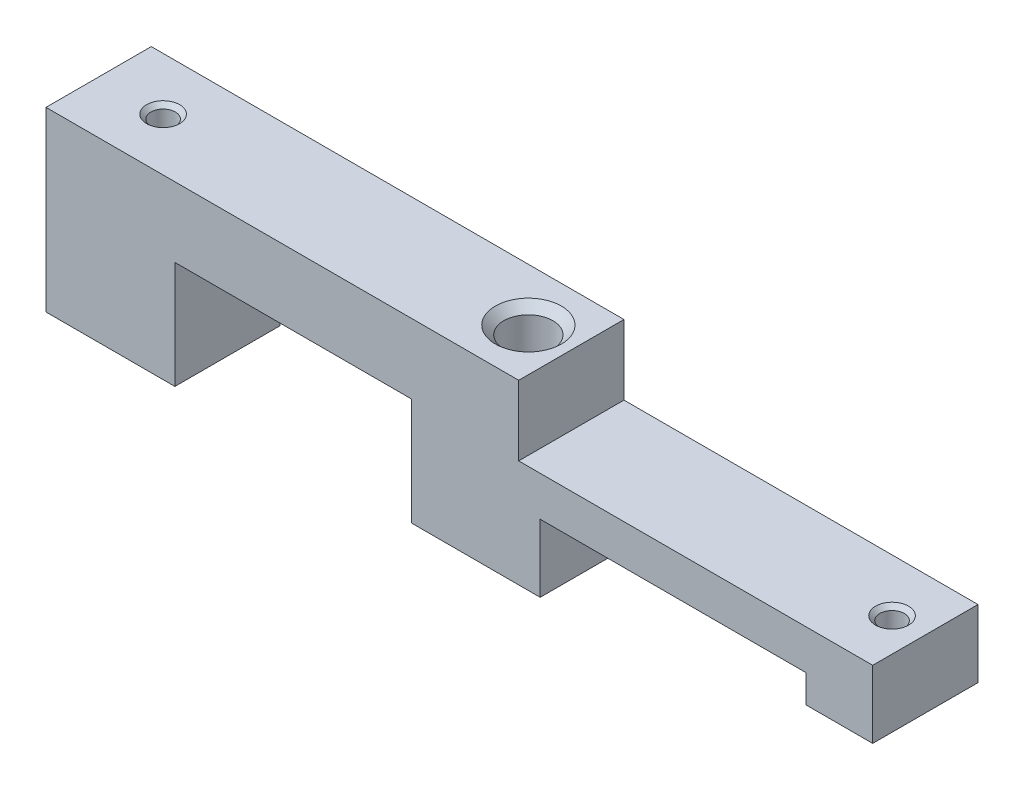
ISO-10303-21;
HEADER;
FILE_DESCRIPTION(('STEP AP214'),'2;1');
FILE_NAME('part.step','',(''),(''),'','','');
FILE_SCHEMA(('AUTOMOTIVE_DESIGN { 1 0 10303 214 1 1 1 1 }'));
ENDSEC;
DATA;
#1=APPLICATION_CONTEXT('core data for automotive mechanical design processes');
#2=APPLICATION_PROTOCOL_DEFINITION('international standard','automotive_design',2000,#1);
#3=PRODUCT_CONTEXT('',#1,'mechanical');
#4=PRODUCT('Part','Part','',(#3));
#5=PRODUCT_RELATED_PRODUCT_CATEGORY('part','',(#4));
#6=PRODUCT_DEFINITION_FORMATION('','',#4);
#7=PRODUCT_DEFINITION_CONTEXT('part definition',#1,'design');
#8=PRODUCT_DEFINITION('design','',#6,#7);
#9=PRODUCT_DEFINITION_SHAPE('','',#8);
#10=(LENGTH_UNIT() NAMED_UNIT(*) SI_UNIT(.MILLI.,.METRE.));
#11=(NAMED_UNIT(*) PLANE_ANGLE_UNIT() SI_UNIT($,.RADIAN.));
#12=(NAMED_UNIT(*) SI_UNIT($,.STERADIAN.) SOLID_ANGLE_UNIT());
#13=UNCERTAINTY_MEASURE_WITH_UNIT(LENGTH_MEASURE(1.E-05),#10,'distance_accuracy_value','');
#14=(GEOMETRIC_REPRESENTATION_CONTEXT(3) GLOBAL_UNCERTAINTY_ASSIGNED_CONTEXT((#13)) GLOBAL_UNIT_ASSIGNED_CONTEXT((#10,
#11,#12)) REPRESENTATION_CONTEXT('',''));
#15=CARTESIAN_POINT('',(0.,0.,0.));
#16=DIRECTION('',(0.,0.,1.));
#17=DIRECTION('',(1.,0.,0.));
#18=AXIS2_PLACEMENT_3D('',#15,#16,#17);
#19=CARTESIAN_POINT('',(-7.874,3.302,12.446));
#20=DIRECTION('',(1.,0.,0.));
#21=DIRECTION('',(0.,0.,-1.));
#22=AXIS2_PLACEMENT_3D('',#19,#20,#21);
#23=PLANE('',#22);
#24=DIRECTION('',(0.,-1.,0.));
#25=VECTOR('',#24,1.);
#26=CARTESIAN_POINT('',(-7.874,3.302,0.));
#27=LINE('',#26,#25);
#28=CARTESIAN_POINT('',(-7.874,3.302,0.));
#29=VERTEX_POINT('',#28);
#30=CARTESIAN_POINT('',(-7.874,0.,0.));
#31=VERTEX_POINT('',#30);
#32=EDGE_CURVE('E185',#29,#31,#27,.T.);
#33=ORIENTED_EDGE('',*,*,#32,.T.);
#34=DIRECTION('',(0.,0.,-1.));
#35=VECTOR('',#34,1.);
#36=CARTESIAN_POINT('',(-7.874,0.,12.446));
#37=LINE('',#36,#35);
#38=CARTESIAN_POINT('',(-7.874,0.,12.446));
#39=VERTEX_POINT('',#38);
#40=EDGE_CURVE('E271',#39,#31,#37,.T.);
#41=ORIENTED_EDGE('',*,*,#40,.F.);
#42=DIRECTION('',(0.,-1.,0.));
#43=VECTOR('',#42,1.);
#44=CARTESIAN_POINT('',(-7.874,3.302,12.446));
#45=LINE('',#44,#43);
#46=CARTESIAN_POINT('',(-7.874,3.302,12.446));
#47=VERTEX_POINT('',#46);
#48=EDGE_CURVE('E228',#47,#39,#45,.T.);
#49=ORIENTED_EDGE('',*,*,#48,.F.);
#50=DIRECTION('',(0.,0.,-1.));
#51=VECTOR('',#50,1.);
#52=CARTESIAN_POINT('',(-7.874,3.302,12.446));
#53=LINE('',#52,#51);
#54=EDGE_CURVE('E181',#47,#29,#53,.T.);
#55=ORIENTED_EDGE('',*,*,#54,.T.);
#56=EDGE_LOOP('',(#33,#41,#49,#55));
#57=FACE_BOUND('',#56,.T.);
#58=ADVANCED_FACE('F45',(#57),#23,.F.);
#59=CARTESIAN_POINT('',(-7.874,0.,12.446));
#60=DIRECTION('',(0.,1.,0.));
#61=DIRECTION('',(0.,0.,1.));
#62=AXIS2_PLACEMENT_3D('',#59,#60,#61);
#63=PLANE('',#62);
#64=CARTESIAN_POINT('',(-3.937,0.,6.223));
#65=DIRECTION('',(0.,-1.,0.));
#66=DIRECTION('',(0.,0.,-1.));
#67=AXIS2_PLACEMENT_3D('',#64,#65,#66);
#68=CIRCLE('',#67,1.450000021);
#69=CARTESIAN_POINT('',(-3.937,0.,4.772999979));
#70=VERTEX_POINT('',#69);
#71=EDGE_CURVE('E440',#70,#70,#68,.T.);
#72=ORIENTED_EDGE('',*,*,#71,.F.);
#73=EDGE_LOOP('',(#72));
#74=FACE_BOUND('',#73,.T.);
#75=DIRECTION('',(1.,0.,0.));
#76=VECTOR('',#75,1.);
#77=CARTESIAN_POINT('',(-7.874,0.,0.));
#78=LINE('',#77,#76);
#79=CARTESIAN_POINT('',(0.,0.,0.));
#80=VERTEX_POINT('',#79);
#81=EDGE_CURVE('E189',#31,#80,#78,.T.);
#82=ORIENTED_EDGE('',*,*,#81,.T.);
#83=DIRECTION('',(0.,0.,-1.));
#84=VECTOR('',#83,1.);
#85=CARTESIAN_POINT('',(0.,0.,12.446));
#86=LINE('',#85,#84);
#87=CARTESIAN_POINT('',(0.,0.,12.446));
#88=VERTEX_POINT('',#87);
#89=EDGE_CURVE('E267',#88,#80,#86,.T.);
#90=ORIENTED_EDGE('',*,*,#89,.F.);
#91=DIRECTION('',(1.,0.,0.));
#92=VECTOR('',#91,1.);
#93=CARTESIAN_POINT('',(-7.874,0.,12.446));
#94=LINE('',#93,#92);
#95=EDGE_CURVE('E126',#39,#88,#94,.T.);
#96=ORIENTED_EDGE('',*,*,#95,.F.);
#97=ORIENTED_EDGE('',*,*,#40,.T.);
#98=EDGE_LOOP('',(#82,#90,#96,#97));
#99=FACE_BOUND('',#98,.T.);
#100=ADVANCED_FACE('F306',(#74,#99),#63,.F.);
#101=CARTESIAN_POINT('',(0.,0.,12.446));
#102=DIRECTION('',(-1.,0.,0.));
#103=DIRECTION('',(0.,0.,1.));
#104=AXIS2_PLACEMENT_3D('',#101,#102,#103);
#105=PLANE('',#104);
#106=DIRECTION('',(0.,1.,0.));
#107=VECTOR('',#106,1.);
#108=CARTESIAN_POINT('',(0.,0.,0.));
#109=LINE('',#108,#107);
#110=CARTESIAN_POINT('',(0.,8.00100000000001,0.));
#111=VERTEX_POINT('',#110);
#112=EDGE_CURVE('E193',#80,#111,#109,.T.);
#113=ORIENTED_EDGE('',*,*,#112,.T.);
#114=DIRECTION('',(0.,0.,-1.));
#115=VECTOR('',#114,1.);
#116=CARTESIAN_POINT('',(0.,8.00100000000001,12.446));
#117=LINE('',#116,#115);
#118=CARTESIAN_POINT('',(0.,8.00100000000001,12.446));
#119=VERTEX_POINT('',#118);
#120=EDGE_CURVE('E263',#119,#111,#117,.T.);
#121=ORIENTED_EDGE('',*,*,#120,.F.);
#122=DIRECTION('',(0.,1.,0.));
#123=VECTOR('',#122,1.);
#124=CARTESIAN_POINT('',(0.,0.,12.446));
#125=LINE('',#124,#123);
#126=EDGE_CURVE('E431',#88,#119,#125,.T.);
#127=ORIENTED_EDGE('',*,*,#126,.F.);
#128=ORIENTED_EDGE('',*,*,#89,.T.);
#129=EDGE_LOOP('',(#113,#121,#127,#128));
#130=FACE_BOUND('',#129,.T.);
#131=ADVANCED_FACE('F312',(#130),#105,.F.);
#132=CARTESIAN_POINT('',(0.,8.00100000000001,12.446));
#133=DIRECTION('',(0.,-1.,0.));
#134=DIRECTION('',(1.,0.,0.));
#135=AXIS2_PLACEMENT_3D('',#132,#133,#134);
#136=PLANE('',#135);
#137=CARTESIAN_POINT('',(-3.937,8.00100000000001,6.223));
#138=DIRECTION('',(0.,-1.,0.));
#139=DIRECTION('',(1.,0.,0.));
#140=AXIS2_PLACEMENT_3D('',#137,#138,#139);
#141=CIRCLE('',#140,1.95000002099999);
#142=CARTESIAN_POINT('',(-1.98699997900001,8.00100000000001,6.223));
#143=VERTEX_POINT('',#142);
#144=EDGE_CURVE('E282',#143,#143,#141,.T.);
#145=ORIENTED_EDGE('',*,*,#144,.T.);
#146=EDGE_LOOP('',(#145));
#147=FACE_BOUND('',#146,.T.);
#148=DIRECTION('',(-1.,0.,0.));
#149=VECTOR('',#148,1.);
#150=CARTESIAN_POINT('',(0.,8.00100000000001,0.));
#151=LINE('',#150,#149);
#152=CARTESIAN_POINT('',(-41.850200018,8.001,0.));
#153=VERTEX_POINT('',#152);
#154=EDGE_CURVE('E196',#111,#153,#151,.T.);
#155=ORIENTED_EDGE('',*,*,#154,.T.);
#156=DIRECTION('',(0.,0.,-1.));
#157=VECTOR('',#156,1.);
#158=CARTESIAN_POINT('',(-41.850200018,8.001,12.446));
#159=LINE('',#158,#157);
#160=CARTESIAN_POINT('',(-41.850200018,8.001,12.446));
#161=VERTEX_POINT('',#160);
#162=EDGE_CURVE('E259',#161,#153,#159,.T.);
#163=ORIENTED_EDGE('',*,*,#162,.F.);
#164=DIRECTION('',(-1.,0.,0.));
#165=VECTOR('',#164,1.);
#166=CARTESIAN_POINT('',(0.,8.00100000000001,12.446));
#167=LINE('',#166,#165);
#168=EDGE_CURVE('E427',#119,#161,#167,.T.);
#169=ORIENTED_EDGE('',*,*,#168,.F.);
#170=ORIENTED_EDGE('',*,*,#120,.T.);
#171=EDGE_LOOP('',(#155,#163,#169,#170));
#172=FACE_BOUND('',#171,.T.);
#173=ADVANCED_FACE('F413',(#147,#172),#136,.F.);
#174=CARTESIAN_POINT('',(-41.850200018,8.001,12.446));
#175=DIRECTION('',(-1.,0.,0.));
#176=DIRECTION('',(0.,-1.,0.));
#177=AXIS2_PLACEMENT_3D('',#174,#175,#176);
#178=PLANE('',#177);
#179=DIRECTION('',(0.,1.,0.));
#180=VECTOR('',#179,1.);
#181=CARTESIAN_POINT('',(-41.850200018,8.001,0.));
#182=LINE('',#181,#180);
#183=CARTESIAN_POINT('',(-41.850200018,16.256,0.));
#184=VERTEX_POINT('',#183);
#185=EDGE_CURVE('E199',#153,#184,#182,.T.);
#186=ORIENTED_EDGE('',*,*,#185,.T.);
#187=DIRECTION('',(0.,0.,-1.));
#188=VECTOR('',#187,1.);
#189=CARTESIAN_POINT('',(-41.850200018,16.256,12.446));
#190=LINE('',#189,#188);
#191=CARTESIAN_POINT('',(-41.850200018,16.256,12.446));
#192=VERTEX_POINT('',#191);
#193=EDGE_CURVE('E255',#192,#184,#190,.T.);
#194=ORIENTED_EDGE('',*,*,#193,.F.);
#195=DIRECTION('',(0.,1.,0.));
#196=VECTOR('',#195,1.);
#197=CARTESIAN_POINT('',(-41.850200018,8.001,12.446));
#198=LINE('',#197,#196);
#199=EDGE_CURVE('E360',#161,#192,#198,.T.);
#200=ORIENTED_EDGE('',*,*,#199,.F.);
#201=ORIENTED_EDGE('',*,*,#162,.T.);
#202=EDGE_LOOP('',(#186,#194,#200,#201));
#203=FACE_BOUND('',#202,.T.);
#204=ADVANCED_FACE('F340',(#203),#178,.F.);
#205=CARTESIAN_POINT('',(-97.730200018,16.256,12.446));
#206=DIRECTION('',(0.,-1.,0.));
#207=DIRECTION('',(0.,0.,-1.));
#208=AXIS2_PLACEMENT_3D('',#205,#206,#207);
#209=PLANE('',#208);
#210=CARTESIAN_POINT('',(-46.930200018,16.256,6.223));
#211=DIRECTION('',(0.,-1.,0.));
#212=DIRECTION('',(0.,0.,-1.));
#213=AXIS2_PLACEMENT_3D('',#210,#211,#212);
#214=CIRCLE('',#213,3.90000004199997);
#215=CARTESIAN_POINT('',(-46.930200018,16.256,2.32299995800003));
#216=VERTEX_POINT('',#215);
#217=EDGE_CURVE('E56',#216,#216,#214,.T.);
#218=ORIENTED_EDGE('',*,*,#217,.T.);
#219=EDGE_LOOP('',(#218));
#220=FACE_BOUND('',#219,.T.);
#221=CARTESIAN_POINT('',(-90.110200018,16.256,6.223));
#222=DIRECTION('',(0.,-1.,0.));
#223=DIRECTION('',(0.,0.,-1.));
#224=AXIS2_PLACEMENT_3D('',#221,#222,#223);
#225=CIRCLE('',#224,1.95000002099995);
#226=CARTESIAN_POINT('',(-90.110200018,16.256,4.27299997900006));
#227=VERTEX_POINT('',#226);
#228=EDGE_CURVE('E274',#227,#227,#225,.T.);
#229=ORIENTED_EDGE('',*,*,#228,.T.);
#230=EDGE_LOOP('',(#229));
#231=FACE_BOUND('',#230,.T.);
#232=DIRECTION('',(-1.,0.,0.));
#233=VECTOR('',#232,1.);
#234=CARTESIAN_POINT('',(-97.730200018,16.256,0.));
#235=LINE('',#234,#233);
#236=CARTESIAN_POINT('',(-97.730200018,16.256,0.));
#237=VERTEX_POINT('',#236);
#238=EDGE_CURVE('E203',#184,#237,#235,.T.);
#239=ORIENTED_EDGE('',*,*,#238,.T.);
#240=DIRECTION('',(0.,0.,-1.));
#241=VECTOR('',#240,1.);
#242=CARTESIAN_POINT('',(-97.730200018,16.256,12.446));
#243=LINE('',#242,#241);
#244=CARTESIAN_POINT('',(-97.730200018,16.256,12.446));
#245=VERTEX_POINT('',#244);
#246=EDGE_CURVE('E251',#245,#237,#243,.T.);
#247=ORIENTED_EDGE('',*,*,#246,.F.);
#248=DIRECTION('',(-1.,0.,0.));
#249=VECTOR('',#248,1.);
#250=CARTESIAN_POINT('',(-41.850200018,16.256,12.446));
#251=LINE('',#250,#249);
#252=EDGE_CURVE('E354',#192,#245,#251,.T.);
#253=ORIENTED_EDGE('',*,*,#252,.F.);
#254=ORIENTED_EDGE('',*,*,#193,.T.);
#255=EDGE_LOOP('',(#239,#247,#253,#254));
#256=FACE_BOUND('',#255,.T.);
#257=ADVANCED_FACE('F293',(#220,#231,#256),#209,.F.);
#258=CARTESIAN_POINT('',(-97.730200018,8.001,12.446));
#259=DIRECTION('',(1.,0.,0.));
#260=DIRECTION('',(0.,0.,-1.));
#261=AXIS2_PLACEMENT_3D('',#258,#259,#260);
#262=PLANE('',#261);
#263=DIRECTION('',(0.,-1.,0.));
#264=VECTOR('',#263,1.);
#265=CARTESIAN_POINT('',(-97.730200018,8.001,0.));
#266=LINE('',#265,#264);
#267=CARTESIAN_POINT('',(-97.730200018,-4.699,0.));
#268=VERTEX_POINT('',#267);
#269=EDGE_CURVE('E207',#237,#268,#266,.T.);
#270=ORIENTED_EDGE('',*,*,#269,.T.);
#271=DIRECTION('',(0.,0.,-1.));
#272=VECTOR('',#271,1.);
#273=CARTESIAN_POINT('',(-97.730200018,-4.699,12.446));
#274=LINE('',#273,#272);
#275=CARTESIAN_POINT('',(-97.730200018,-4.699,12.446));
#276=VERTEX_POINT('',#275);
#277=EDGE_CURVE('E247',#276,#268,#274,.T.);
#278=ORIENTED_EDGE('',*,*,#277,.F.);
#279=DIRECTION('',(0.,-1.,0.));
#280=VECTOR('',#279,1.);
#281=CARTESIAN_POINT('',(-97.730200018,8.001,12.446));
#282=LINE('',#281,#280);
#283=EDGE_CURVE('E350',#245,#276,#282,.T.);
#284=ORIENTED_EDGE('',*,*,#283,.F.);
#285=ORIENTED_EDGE('',*,*,#246,.T.);
#286=EDGE_LOOP('',(#270,#278,#284,#285));
#287=FACE_BOUND('',#286,.T.);
#288=ADVANCED_FACE('F339',(#287),#262,.F.);
#289=CARTESIAN_POINT('',(-97.730200018,-4.699,12.446));
#290=DIRECTION('',(0.,1.,0.));
#291=DIRECTION('',(0.,0.,1.));
#292=AXIS2_PLACEMENT_3D('',#289,#290,#291);
#293=PLANE('',#292);
#294=DIRECTION('',(1.,0.,0.));
#295=VECTOR('',#294,1.);
#296=CARTESIAN_POINT('',(-97.730200018,-4.699,0.));
#297=LINE('',#296,#295);
#298=CARTESIAN_POINT('',(-82.490200018,-4.699,0.));
#299=VERTEX_POINT('',#298);
#300=EDGE_CURVE('E210',#268,#299,#297,.T.);
#301=ORIENTED_EDGE('',*,*,#300,.T.);
#302=DIRECTION('',(0.,0.,-1.));
#303=VECTOR('',#302,1.);
#304=CARTESIAN_POINT('',(-82.490200018,-4.699,12.446));
#305=LINE('',#304,#303);
#306=CARTESIAN_POINT('',(-82.490200018,-4.699,12.446));
#307=VERTEX_POINT('',#306);
#308=EDGE_CURVE('E243',#307,#299,#305,.T.);
#309=ORIENTED_EDGE('',*,*,#308,.F.);
#310=DIRECTION('',(1.,0.,0.));
#311=VECTOR('',#310,1.);
#312=CARTESIAN_POINT('',(-97.730200018,-4.699,12.446));
#313=LINE('',#312,#311);
#314=EDGE_CURVE('E353',#276,#307,#313,.T.);
#315=ORIENTED_EDGE('',*,*,#314,.F.);
#316=ORIENTED_EDGE('',*,*,#277,.T.);
#317=EDGE_LOOP('',(#301,#309,#315,#316));
#318=FACE_BOUND('',#317,.T.);
#319=ADVANCED_FACE('F404',(#318),#293,.F.);
#320=CARTESIAN_POINT('',(-82.490200018,-4.699,12.446));
#321=DIRECTION('',(-1.,0.,0.));
#322=DIRECTION('',(0.,0.,1.));
#323=AXIS2_PLACEMENT_3D('',#320,#321,#322);
#324=PLANE('',#323);
#325=DIRECTION('',(0.,1.,0.));
#326=VECTOR('',#325,1.);
#327=CARTESIAN_POINT('',(-82.490200018,-4.699,0.));
#328=LINE('',#327,#326);
#329=CARTESIAN_POINT('',(-82.490200018,8.001,0.));
#330=VERTEX_POINT('',#329);
#331=EDGE_CURVE('E213',#299,#330,#328,.T.);
#332=ORIENTED_EDGE('',*,*,#331,.T.);
#333=DIRECTION('',(0.,0.,-1.));
#334=VECTOR('',#333,1.);
#335=CARTESIAN_POINT('',(-82.490200018,8.001,12.446));
#336=LINE('',#335,#334);
#337=CARTESIAN_POINT('',(-82.490200018,8.001,12.446));
#338=VERTEX_POINT('',#337);
#339=EDGE_CURVE('E239',#338,#330,#336,.T.);
#340=ORIENTED_EDGE('',*,*,#339,.F.);
#341=DIRECTION('',(0.,1.,0.));
#342=VECTOR('',#341,1.);
#343=CARTESIAN_POINT('',(-82.490200018,-4.699,12.446));
#344=LINE('',#343,#342);
#345=EDGE_CURVE('E358',#307,#338,#344,.T.);
#346=ORIENTED_EDGE('',*,*,#345,.F.);
#347=ORIENTED_EDGE('',*,*,#308,.T.);
#348=EDGE_LOOP('',(#332,#340,#346,#347));
#349=FACE_BOUND('',#348,.T.);
#350=ADVANCED_FACE('F401',(#349),#324,.F.);
#351=CARTESIAN_POINT('',(-82.490200018,8.001,12.446));
#352=DIRECTION('',(0.,1.,0.));
#353=DIRECTION('',(0.,0.,1.));
#354=AXIS2_PLACEMENT_3D('',#351,#352,#353);
#355=PLANE('',#354);
#356=DIRECTION('',(1.,0.,0.));
#357=VECTOR('',#356,1.);
#358=CARTESIAN_POINT('',(-82.490200018,8.001,0.));
#359=LINE('',#358,#357);
#360=CARTESIAN_POINT('',(-54.550200018,8.001,0.));
#361=VERTEX_POINT('',#360);
#362=EDGE_CURVE('E216',#330,#361,#359,.T.);
#363=ORIENTED_EDGE('',*,*,#362,.T.);
#364=DIRECTION('',(0.,0.,-1.));
#365=VECTOR('',#364,1.);
#366=CARTESIAN_POINT('',(-54.550200018,8.001,12.446));
#367=LINE('',#366,#365);
#368=CARTESIAN_POINT('',(-54.550200018,8.001,12.446));
#369=VERTEX_POINT('',#368);
#370=EDGE_CURVE('E235',#369,#361,#367,.T.);
#371=ORIENTED_EDGE('',*,*,#370,.F.);
#372=DIRECTION('',(1.,0.,0.));
#373=VECTOR('',#372,1.);
#374=CARTESIAN_POINT('',(-82.490200018,8.001,12.446));
#375=LINE('',#374,#373);
#376=EDGE_CURVE('E366',#338,#369,#375,.T.);
#377=ORIENTED_EDGE('',*,*,#376,.F.);
#378=ORIENTED_EDGE('',*,*,#339,.T.);
#379=EDGE_LOOP('',(#363,#371,#377,#378));
#380=FACE_BOUND('',#379,.T.);
#381=ADVANCED_FACE('F374',(#380),#355,.F.);
#382=CARTESIAN_POINT('',(-54.550200018,8.001,12.446));
#383=DIRECTION('',(1.,0.,0.));
#384=DIRECTION('',(0.,0.,-1.));
#385=AXIS2_PLACEMENT_3D('',#382,#383,#384);
#386=PLANE('',#385);
#387=DIRECTION('',(0.,-1.,0.));
#388=VECTOR('',#387,1.);
#389=CARTESIAN_POINT('',(-54.550200018,8.001,0.));
#390=LINE('',#389,#388);
#391=CARTESIAN_POINT('',(-54.550200018,-4.699,0.));
#392=VERTEX_POINT('',#391);
#393=EDGE_CURVE('E219',#361,#392,#390,.T.);
#394=ORIENTED_EDGE('',*,*,#393,.T.);
#395=DIRECTION('',(0.,0.,-1.));
#396=VECTOR('',#395,1.);
#397=CARTESIAN_POINT('',(-54.550200018,-4.699,12.446));
#398=LINE('',#397,#396);
#399=CARTESIAN_POINT('',(-54.550200018,-4.699,12.446));
#400=VERTEX_POINT('',#399);
#401=EDGE_CURVE('E174',#400,#392,#398,.T.);
#402=ORIENTED_EDGE('',*,*,#401,.F.);
#403=DIRECTION('',(0.,-1.,0.));
#404=VECTOR('',#403,1.);
#405=CARTESIAN_POINT('',(-54.550200018,8.001,12.446));
#406=LINE('',#405,#404);
#407=EDGE_CURVE('E163',#369,#400,#406,.T.);
#408=ORIENTED_EDGE('',*,*,#407,.F.);
#409=ORIENTED_EDGE('',*,*,#370,.T.);
#410=EDGE_LOOP('',(#394,#402,#408,#409));
#411=FACE_BOUND('',#410,.T.);
#412=ADVANCED_FACE('F378',(#411),#386,.F.);
#413=CARTESIAN_POINT('',(-54.550200018,-4.699,12.446));
#414=DIRECTION('',(0.,1.,0.));
#415=DIRECTION('',(0.,0.,1.));
#416=AXIS2_PLACEMENT_3D('',#413,#414,#415);
#417=PLANE('',#416);
#418=DIRECTION('',(1.,0.,0.));
#419=VECTOR('',#418,1.);
#420=CARTESIAN_POINT('',(-54.550200018,-4.699,0.));
#421=LINE('',#420,#419);
#422=CARTESIAN_POINT('',(-39.310200018,-4.699,0.));
#423=VERTEX_POINT('',#422);
#424=EDGE_CURVE('E172',#392,#423,#421,.T.);
#425=ORIENTED_EDGE('',*,*,#424,.T.);
#426=DIRECTION('',(0.,0.,-1.));
#427=VECTOR('',#426,1.);
#428=CARTESIAN_POINT('',(-39.310200018,-4.699,12.446));
#429=LINE('',#428,#427);
#430=CARTESIAN_POINT('',(-39.310200018,-4.699,12.446));
#431=VERTEX_POINT('',#430);
#432=EDGE_CURVE('E169',#431,#423,#429,.T.);
#433=ORIENTED_EDGE('',*,*,#432,.F.);
#434=DIRECTION('',(1.,0.,0.));
#435=VECTOR('',#434,1.);
#436=CARTESIAN_POINT('',(-54.550200018,-4.699,12.446));
#437=LINE('',#436,#435);
#438=EDGE_CURVE('E157',#400,#431,#437,.T.);
#439=ORIENTED_EDGE('',*,*,#438,.F.);
#440=ORIENTED_EDGE('',*,*,#401,.T.);
#441=EDGE_LOOP('',(#425,#433,#439,#440));
#442=FACE_BOUND('',#441,.T.);
#443=ADVANCED_FACE('F170',(#442),#417,.F.);
#444=CARTESIAN_POINT('',(-39.310200018,-4.699,12.446));
#445=DIRECTION('',(-1.,0.,0.));
#446=DIRECTION('',(0.,0.,1.));
#447=AXIS2_PLACEMENT_3D('',#444,#445,#446);
#448=PLANE('',#447);
#449=DIRECTION('',(0.,1.,0.));
#450=VECTOR('',#449,1.);
#451=CARTESIAN_POINT('',(-39.310200018,-4.699,0.));
#452=LINE('',#451,#450);
#453=CARTESIAN_POINT('',(-39.310200018,3.302,0.));
#454=VERTEX_POINT('',#453);
#455=EDGE_CURVE('E111',#423,#454,#452,.T.);
#456=ORIENTED_EDGE('',*,*,#455,.T.);
#457=DIRECTION('',(0.,0.,-1.));
#458=VECTOR('',#457,1.);
#459=CARTESIAN_POINT('',(-39.310200018,3.302,12.446));
#460=LINE('',#459,#458);
#461=CARTESIAN_POINT('',(-39.310200018,3.302,12.446));
#462=VERTEX_POINT('',#461);
#463=EDGE_CURVE('E175',#462,#454,#460,.T.);
#464=ORIENTED_EDGE('',*,*,#463,.F.);
#465=DIRECTION('',(0.,1.,0.));
#466=VECTOR('',#465,1.);
#467=CARTESIAN_POINT('',(-39.310200018,-4.699,12.446));
#468=LINE('',#467,#466);
#469=EDGE_CURVE('E161',#431,#462,#468,.T.);
#470=ORIENTED_EDGE('',*,*,#469,.F.);
#471=ORIENTED_EDGE('',*,*,#432,.T.);
#472=EDGE_LOOP('',(#456,#464,#470,#471));
#473=FACE_BOUND('',#472,.T.);
#474=ADVANCED_FACE('F177',(#473),#448,.F.);
#475=CARTESIAN_POINT('',(-39.310200018,3.302,12.446));
#476=DIRECTION('',(0.,1.,0.));
#477=DIRECTION('',(0.,0.,1.));
#478=AXIS2_PLACEMENT_3D('',#475,#476,#477);
#479=PLANE('',#478);
#480=DIRECTION('',(1.,0.,0.));
#481=VECTOR('',#480,1.);
#482=CARTESIAN_POINT('',(-39.310200018,3.302,0.));
#483=LINE('',#482,#481);
#484=EDGE_CURVE('E117',#454,#29,#483,.T.);
#485=ORIENTED_EDGE('',*,*,#484,.T.);
#486=ORIENTED_EDGE('',*,*,#54,.F.);
#487=DIRECTION('',(1.,0.,0.));
#488=VECTOR('',#487,1.);
#489=CARTESIAN_POINT('',(-39.310200018,3.302,12.446));
#490=LINE('',#489,#488);
#491=EDGE_CURVE('E64',#462,#47,#490,.T.);
#492=ORIENTED_EDGE('',*,*,#491,.F.);
#493=ORIENTED_EDGE('',*,*,#463,.T.);
#494=EDGE_LOOP('',(#485,#486,#492,#493));
#495=FACE_BOUND('',#494,.T.);
#496=ADVANCED_FACE('F384',(#495),#479,.F.);
#497=CARTESIAN_POINT('',(0.,0.,12.446));
#498=DIRECTION('',(0.,0.,1.));
#499=DIRECTION('',(1.,0.,0.));
#500=AXIS2_PLACEMENT_3D('',#497,#498,#499);
#501=PLANE('',#500);
#502=ORIENTED_EDGE('',*,*,#48,.T.);
#503=ORIENTED_EDGE('',*,*,#95,.T.);
#504=ORIENTED_EDGE('',*,*,#126,.T.);
#505=ORIENTED_EDGE('',*,*,#168,.T.);
#506=ORIENTED_EDGE('',*,*,#199,.T.);
#507=ORIENTED_EDGE('',*,*,#252,.T.);
#508=ORIENTED_EDGE('',*,*,#283,.T.);
#509=ORIENTED_EDGE('',*,*,#314,.T.);
#510=ORIENTED_EDGE('',*,*,#345,.T.);
#511=ORIENTED_EDGE('',*,*,#376,.T.);
#512=ORIENTED_EDGE('',*,*,#407,.T.);
#513=ORIENTED_EDGE('',*,*,#438,.T.);
#514=ORIENTED_EDGE('',*,*,#469,.T.);
#515=ORIENTED_EDGE('',*,*,#491,.T.);
#516=EDGE_LOOP('',(#502,#503,#504,#505,#506,#507,#508,#509,#510,#511,#512,#513,#514,#515));
#517=FACE_BOUND('',#516,.T.);
#518=ADVANCED_FACE('F159',(#517),#501,.T.);
#519=CARTESIAN_POINT('',(0.,0.,0.));
#520=DIRECTION('',(0.,0.,1.));
#521=DIRECTION('',(1.,0.,0.));
#522=AXIS2_PLACEMENT_3D('',#519,#520,#521);
#523=PLANE('',#522);
#524=ORIENTED_EDGE('',*,*,#32,.F.);
#525=ORIENTED_EDGE('',*,*,#484,.F.);
#526=ORIENTED_EDGE('',*,*,#455,.F.);
#527=ORIENTED_EDGE('',*,*,#424,.F.);
#528=ORIENTED_EDGE('',*,*,#393,.F.);
#529=ORIENTED_EDGE('',*,*,#362,.F.);
#530=ORIENTED_EDGE('',*,*,#331,.F.);
#531=ORIENTED_EDGE('',*,*,#300,.F.);
#532=ORIENTED_EDGE('',*,*,#269,.F.);
#533=ORIENTED_EDGE('',*,*,#238,.F.);
#534=ORIENTED_EDGE('',*,*,#185,.F.);
#535=ORIENTED_EDGE('',*,*,#154,.F.);
#536=ORIENTED_EDGE('',*,*,#112,.F.);
#537=ORIENTED_EDGE('',*,*,#81,.F.);
#538=EDGE_LOOP('',(#524,#525,#526,#527,#528,#529,#530,#531,#532,#533,#534,#535,#536,#537));
#539=FACE_BOUND('',#538,.T.);
#540=ADVANCED_FACE('F380',(#539),#523,.F.);
#541=CARTESIAN_POINT('',(-46.930200018,16.256,6.223));
#542=DIRECTION('',(0.,-1.,0.));
#543=DIRECTION('',(0.,0.,-1.));
#544=AXIS2_PLACEMENT_3D('',#541,#542,#543);
#545=CYLINDRICAL_SURFACE('',#544,2.900000042);
#546=CARTESIAN_POINT('',(-46.930200018,15.256,6.223));
#547=DIRECTION('',(0.,-1.,0.));
#548=DIRECTION('',(0.,0.,-1.));
#549=AXIS2_PLACEMENT_3D('',#546,#547,#548);
#550=CIRCLE('',#549,2.900000042);
#551=CARTESIAN_POINT('',(-46.930200018,15.256,3.322999958));
#552=VERTEX_POINT('',#551);
#553=EDGE_CURVE('E11',#552,#552,#550,.F.);
#554=ORIENTED_EDGE('',*,*,#553,.T.);
#555=EDGE_LOOP('',(#554));
#556=FACE_BOUND('',#555,.T.);
#557=CARTESIAN_POINT('',(-46.930200018,0.,6.223));
#558=DIRECTION('',(0.,-1.,0.));
#559=DIRECTION('',(0.,0.,-1.));
#560=AXIS2_PLACEMENT_3D('',#557,#558,#559);
#561=CIRCLE('',#560,2.900000042);
#562=CARTESIAN_POINT('',(-46.930200018,0.,3.322999958));
#563=VERTEX_POINT('',#562);
#564=EDGE_CURVE('E444',#563,#563,#561,.T.);
#565=ORIENTED_EDGE('',*,*,#564,.T.);
#566=EDGE_LOOP('',(#565));
#567=FACE_BOUND('',#566,.T.);
#568=ADVANCED_FACE('F463',(#556,#567),#545,.F.);
#569=CARTESIAN_POINT('',(-46.930200018,0.,6.223));
#570=DIRECTION('',(0.,-1.,0.));
#571=DIRECTION('',(0.,0.,-1.));
#572=AXIS2_PLACEMENT_3D('',#569,#570,#571);
#573=PLANE('',#572);
#574=ORIENTED_EDGE('',*,*,#564,.F.);
#575=EDGE_LOOP('',(#574));
#576=FACE_BOUND('',#575,.T.);
#577=ADVANCED_FACE('F459',(#576),#573,.F.);
#578=CARTESIAN_POINT('',(-90.110200018,16.256,6.223));
#579=DIRECTION('',(0.,-1.,0.));
#580=DIRECTION('',(0.,0.,-1.));
#581=AXIS2_PLACEMENT_3D('',#578,#579,#580);
#582=CYLINDRICAL_SURFACE('',#581,1.45000002099999);
#583=CARTESIAN_POINT('',(-90.110200018,15.756,6.223));
#584=DIRECTION('',(0.,-1.,0.));
#585=DIRECTION('',(0.,0.,-1.));
#586=AXIS2_PLACEMENT_3D('',#583,#584,#585);
#587=CIRCLE('',#586,1.45000002099999);
#588=CARTESIAN_POINT('',(-90.110200018,15.756,4.77299997900001));
#589=VERTEX_POINT('',#588);
#590=EDGE_CURVE('E278',#589,#589,#587,.F.);
#591=ORIENTED_EDGE('',*,*,#590,.T.);
#592=EDGE_LOOP('',(#591));
#593=FACE_BOUND('',#592,.T.);
#594=CARTESIAN_POINT('',(-90.110200018,0.,6.223));
#595=DIRECTION('',(0.,-1.,0.));
#596=DIRECTION('',(0.,0.,-1.));
#597=AXIS2_PLACEMENT_3D('',#594,#595,#596);
#598=CIRCLE('',#597,1.45000002099999);
#599=CARTESIAN_POINT('',(-90.110200018,0.,4.77299997900001));
#600=VERTEX_POINT('',#599);
#601=EDGE_CURVE('E190',#600,#600,#598,.T.);
#602=ORIENTED_EDGE('',*,*,#601,.T.);
#603=EDGE_LOOP('',(#602));
#604=FACE_BOUND('',#603,.T.);
#605=ADVANCED_FACE('F452',(#593,#604),#582,.F.);
#606=CARTESIAN_POINT('',(-90.110200018,0.,6.223));
#607=DIRECTION('',(0.,-1.,0.));
#608=DIRECTION('',(0.,0.,-1.));
#609=AXIS2_PLACEMENT_3D('',#606,#607,#608);
#610=PLANE('',#609);
#611=ORIENTED_EDGE('',*,*,#601,.F.);
#612=EDGE_LOOP('',(#611));
#613=FACE_BOUND('',#612,.T.);
#614=ADVANCED_FACE('F331',(#613),#610,.F.);
#615=CARTESIAN_POINT('',(-3.937,16.256,6.223));
#616=DIRECTION('',(0.,-1.,0.));
#617=DIRECTION('',(0.,0.,-1.));
#618=AXIS2_PLACEMENT_3D('',#615,#616,#617);
#619=CYLINDRICAL_SURFACE('',#618,1.450000021);
#620=CARTESIAN_POINT('',(-3.937,7.50100000000001,6.223));
#621=DIRECTION('',(0.,-1.,0.));
#622=DIRECTION('',(0.,0.,-1.));
#623=AXIS2_PLACEMENT_3D('',#620,#621,#622);
#624=CIRCLE('',#623,1.450000021);
#625=CARTESIAN_POINT('',(-3.937,7.50100000000001,4.772999979));
#626=VERTEX_POINT('',#625);
#627=EDGE_CURVE('E286',#626,#626,#624,.F.);
#628=ORIENTED_EDGE('',*,*,#627,.T.);
#629=EDGE_LOOP('',(#628));
#630=FACE_BOUND('',#629,.T.);
#631=ORIENTED_EDGE('',*,*,#71,.T.);
#632=EDGE_LOOP('',(#631));
#633=FACE_BOUND('',#632,.T.);
#634=ADVANCED_FACE('F322',(#630,#633),#619,.F.);
#635=CARTESIAN_POINT('',(-90.110200018,16.256,6.223));
#636=DIRECTION('',(0.,1.,0.));
#637=DIRECTION('',(0.,0.,1.));
#638=AXIS2_PLACEMENT_3D('',#635,#636,#637);
#639=CONICAL_SURFACE('',#638,1.95000002099995,0.785398163397441);
#640=ORIENTED_EDGE('',*,*,#590,.F.);
#641=EDGE_LOOP('',(#640));
#642=FACE_BOUND('',#641,.T.);
#643=ORIENTED_EDGE('',*,*,#228,.F.);
#644=EDGE_LOOP('',(#643));
#645=FACE_BOUND('',#644,.T.);
#646=ADVANCED_FACE('F302',(#642,#645),#639,.F.);
#647=CARTESIAN_POINT('',(-3.937,8.00100000000001,6.223));
#648=DIRECTION('',(0.,1.,0.));
#649=DIRECTION('',(0.,0.,1.));
#650=AXIS2_PLACEMENT_3D('',#647,#648,#649);
#651=CONICAL_SURFACE('',#650,1.95000002099999,0.78539816339744);
#652=ORIENTED_EDGE('',*,*,#627,.F.);
#653=EDGE_LOOP('',(#652));
#654=FACE_BOUND('',#653,.T.);
#655=ORIENTED_EDGE('',*,*,#144,.F.);
#656=EDGE_LOOP('',(#655));
#657=FACE_BOUND('',#656,.T.);
#658=ADVANCED_FACE('F297',(#654,#657),#651,.F.);
#659=CARTESIAN_POINT('',(-46.930200018,16.256,6.223));
#660=DIRECTION('',(0.,1.,0.));
#661=DIRECTION('',(0.,0.,1.));
#662=AXIS2_PLACEMENT_3D('',#659,#660,#661);
#663=CONICAL_SURFACE('',#662,3.90000004199997,0.785398163397447);
#664=ORIENTED_EDGE('',*,*,#553,.F.);
#665=EDGE_LOOP('',(#664));
#666=FACE_BOUND('',#665,.T.);
#667=ORIENTED_EDGE('',*,*,#217,.F.);
#668=EDGE_LOOP('',(#667));
#669=FACE_BOUND('',#668,.T.);
#670=ADVANCED_FACE('F48',(#666,#669),#663,.F.);
#671=CLOSED_SHELL('',(#58,#100,#131,#173,#204,#257,#288,#319,#350,#381,#412,#443,#474,#496,#518,
#540,#568,#577,#605,#614,#634,#646,#658,#670));
#672=MANIFOLD_SOLID_BREP('B2',#671);
#673=ADVANCED_BREP_SHAPE_REPRESENTATION('',(#18,#672),#14);
#674=SHAPE_DEFINITION_REPRESENTATION(#9,#673);
ENDSEC;
END-ISO-10303-21;
